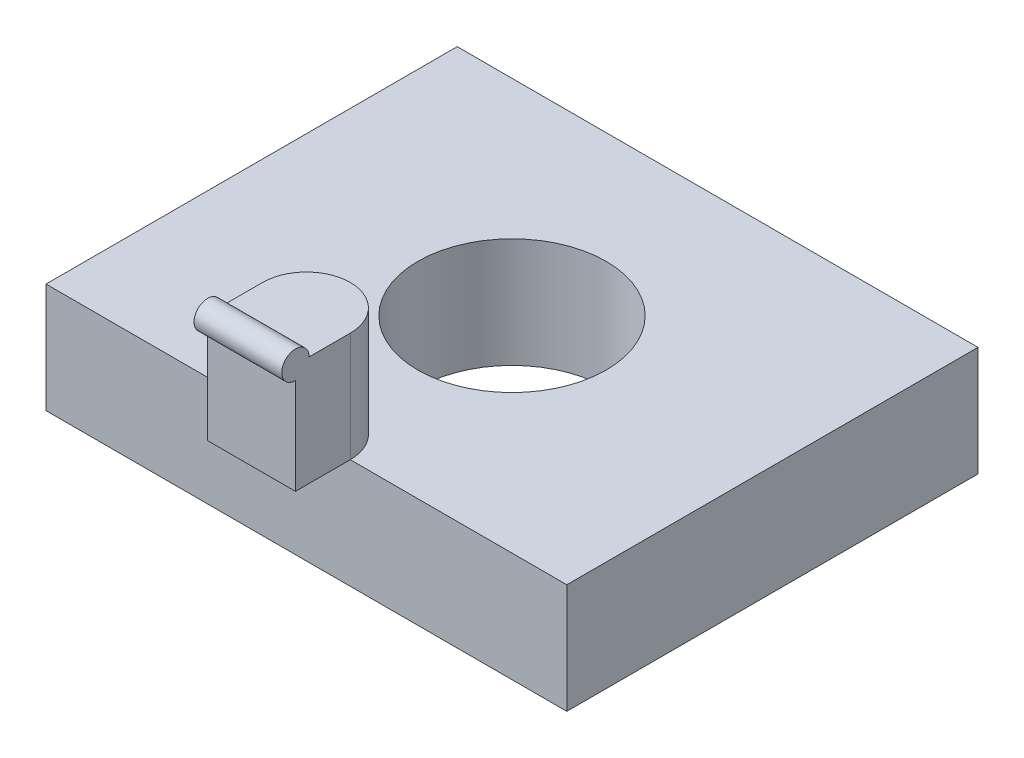
ISO-10303-21;
HEADER;
FILE_DESCRIPTION(('STEP AP214'),'2;1');
FILE_NAME('part.step','',(''),(''),'','','');
FILE_SCHEMA(('AUTOMOTIVE_DESIGN { 1 0 10303 214 1 1 1 1 }'));
ENDSEC;
DATA;
#1=APPLICATION_CONTEXT('core data for automotive mechanical design processes');
#2=APPLICATION_PROTOCOL_DEFINITION('international standard','automotive_design',2000,#1);
#3=PRODUCT_CONTEXT('',#1,'mechanical');
#4=PRODUCT('Part','Part','',(#3));
#5=PRODUCT_RELATED_PRODUCT_CATEGORY('part','',(#4));
#6=PRODUCT_DEFINITION_FORMATION('','',#4);
#7=PRODUCT_DEFINITION_CONTEXT('part definition',#1,'design');
#8=PRODUCT_DEFINITION('design','',#6,#7);
#9=PRODUCT_DEFINITION_SHAPE('','',#8);
#10=(LENGTH_UNIT() NAMED_UNIT(*) SI_UNIT(.MILLI.,.METRE.));
#11=(NAMED_UNIT(*) PLANE_ANGLE_UNIT() SI_UNIT($,.RADIAN.));
#12=(NAMED_UNIT(*) SI_UNIT($,.STERADIAN.) SOLID_ANGLE_UNIT());
#13=UNCERTAINTY_MEASURE_WITH_UNIT(LENGTH_MEASURE(1.E-05),#10,'distance_accuracy_value','');
#14=(GEOMETRIC_REPRESENTATION_CONTEXT(3) GLOBAL_UNCERTAINTY_ASSIGNED_CONTEXT((#13)) GLOBAL_UNIT_ASSIGNED_CONTEXT((#10,
#11,#12)) REPRESENTATION_CONTEXT('',''));
#15=CARTESIAN_POINT('',(0.,0.,0.));
#16=DIRECTION('',(0.,0.,1.));
#17=DIRECTION('',(1.,0.,0.));
#18=AXIS2_PLACEMENT_3D('',#15,#16,#17);
#19=CARTESIAN_POINT('',(-47.5,10.,37.5));
#20=DIRECTION('',(0.,0.,-1.));
#21=DIRECTION('',(-1.,0.,0.));
#22=AXIS2_PLACEMENT_3D('',#19,#20,#21);
#23=PLANE('',#22);
#24=DIRECTION('',(1.,0.,0.));
#25=VECTOR('',#24,1.);
#26=CARTESIAN_POINT('',(-8.,10.,37.5));
#27=LINE('',#26,#25);
#28=CARTESIAN_POINT('',(-8.,10.,37.5));
#29=VERTEX_POINT('',#28);
#30=CARTESIAN_POINT('',(8.,10.,37.5));
#31=VERTEX_POINT('',#30);
#32=EDGE_CURVE('E135',#29,#31,#27,.T.);
#33=ORIENTED_EDGE('',*,*,#32,.F.);
#34=DIRECTION('',(1.,0.,0.));
#35=VECTOR('',#34,1.);
#36=CARTESIAN_POINT('',(-47.5,10.,37.5));
#37=LINE('',#36,#35);
#38=CARTESIAN_POINT('',(-47.5,10.,37.5));
#39=VERTEX_POINT('',#38);
#40=EDGE_CURVE('E170',#39,#29,#37,.T.);
#41=ORIENTED_EDGE('',*,*,#40,.F.);
#42=DIRECTION('',(0.,-1.,0.));
#43=VECTOR('',#42,1.);
#44=CARTESIAN_POINT('',(-47.5,10.,37.5));
#45=LINE('',#44,#43);
#46=CARTESIAN_POINT('',(-47.5,-10.,37.5));
#47=VERTEX_POINT('',#46);
#48=EDGE_CURVE('E183',#39,#47,#45,.T.);
#49=ORIENTED_EDGE('',*,*,#48,.T.);
#50=DIRECTION('',(1.,0.,0.));
#51=VECTOR('',#50,1.);
#52=CARTESIAN_POINT('',(-47.5,-10.,37.5));
#53=LINE('',#52,#51);
#54=CARTESIAN_POINT('',(47.5,-10.,37.5));
#55=VERTEX_POINT('',#54);
#56=EDGE_CURVE('E165',#47,#55,#53,.T.);
#57=ORIENTED_EDGE('',*,*,#56,.T.);
#58=DIRECTION('',(0.,-1.,0.));
#59=VECTOR('',#58,1.);
#60=CARTESIAN_POINT('',(47.5,10.,37.5));
#61=LINE('',#60,#59);
#62=CARTESIAN_POINT('',(47.5,10.,37.5));
#63=VERTEX_POINT('',#62);
#64=EDGE_CURVE('E173',#63,#55,#61,.T.);
#65=ORIENTED_EDGE('',*,*,#64,.F.);
#66=EDGE_CURVE('E169',#31,#63,#37,.T.);
#67=ORIENTED_EDGE('',*,*,#66,.F.);
#68=EDGE_LOOP('',(#33,#41,#49,#57,#65,#67));
#69=FACE_BOUND('',#68,.T.);
#70=ADVANCED_FACE('F39',(#69),#23,.F.);
#71=CARTESIAN_POINT('',(47.5,10.,-37.5));
#72=DIRECTION('',(-1.,0.,0.));
#73=DIRECTION('',(0.,0.,1.));
#74=AXIS2_PLACEMENT_3D('',#71,#72,#73);
#75=PLANE('',#74);
#76=DIRECTION('',(0.,0.,-1.));
#77=VECTOR('',#76,1.);
#78=CARTESIAN_POINT('',(47.5,-10.,-37.5));
#79=LINE('',#78,#77);
#80=CARTESIAN_POINT('',(47.5,-10.,-37.5));
#81=VERTEX_POINT('',#80);
#82=EDGE_CURVE('E160',#55,#81,#79,.T.);
#83=ORIENTED_EDGE('',*,*,#82,.T.);
#84=DIRECTION('',(0.,-1.,0.));
#85=VECTOR('',#84,1.);
#86=CARTESIAN_POINT('',(47.5,10.,-37.5));
#87=LINE('',#86,#85);
#88=CARTESIAN_POINT('',(47.5,10.,-37.5));
#89=VERTEX_POINT('',#88);
#90=EDGE_CURVE('E47',#89,#81,#87,.T.);
#91=ORIENTED_EDGE('',*,*,#90,.F.);
#92=DIRECTION('',(0.,0.,-1.));
#93=VECTOR('',#92,1.);
#94=CARTESIAN_POINT('',(47.5,10.,-37.5));
#95=LINE('',#94,#93);
#96=EDGE_CURVE('E161',#63,#89,#95,.T.);
#97=ORIENTED_EDGE('',*,*,#96,.F.);
#98=ORIENTED_EDGE('',*,*,#64,.T.);
#99=EDGE_LOOP('',(#83,#91,#97,#98));
#100=FACE_BOUND('',#99,.T.);
#101=ADVANCED_FACE('F41',(#100),#75,.F.);
#102=CARTESIAN_POINT('',(-47.5,10.,-37.5));
#103=DIRECTION('',(0.,0.,1.));
#104=DIRECTION('',(1.,0.,0.));
#105=AXIS2_PLACEMENT_3D('',#102,#103,#104);
#106=PLANE('',#105);
#107=DIRECTION('',(-1.,0.,0.));
#108=VECTOR('',#107,1.);
#109=CARTESIAN_POINT('',(-47.5,-10.,-37.5));
#110=LINE('',#109,#108);
#111=CARTESIAN_POINT('',(-47.5,-10.,-37.5));
#112=VERTEX_POINT('',#111);
#113=EDGE_CURVE('E176',#81,#112,#110,.T.);
#114=ORIENTED_EDGE('',*,*,#113,.T.);
#115=DIRECTION('',(0.,-1.,0.));
#116=VECTOR('',#115,1.);
#117=CARTESIAN_POINT('',(-47.5,10.,-37.5));
#118=LINE('',#117,#116);
#119=CARTESIAN_POINT('',(-47.5,10.,-37.5));
#120=VERTEX_POINT('',#119);
#121=EDGE_CURVE('E186',#120,#112,#118,.T.);
#122=ORIENTED_EDGE('',*,*,#121,.F.);
#123=DIRECTION('',(-1.,0.,0.));
#124=VECTOR('',#123,1.);
#125=CARTESIAN_POINT('',(-47.5,10.,-37.5));
#126=LINE('',#125,#124);
#127=EDGE_CURVE('E164',#89,#120,#126,.T.);
#128=ORIENTED_EDGE('',*,*,#127,.F.);
#129=ORIENTED_EDGE('',*,*,#90,.T.);
#130=EDGE_LOOP('',(#114,#122,#128,#129));
#131=FACE_BOUND('',#130,.T.);
#132=ADVANCED_FACE('F191',(#131),#106,.F.);
#133=CARTESIAN_POINT('',(-47.5,10.,-37.5));
#134=DIRECTION('',(1.,0.,0.));
#135=DIRECTION('',(0.,0.,-1.));
#136=AXIS2_PLACEMENT_3D('',#133,#134,#135);
#137=PLANE('',#136);
#138=DIRECTION('',(0.,0.,1.));
#139=VECTOR('',#138,1.);
#140=CARTESIAN_POINT('',(-47.5,-10.,-37.5));
#141=LINE('',#140,#139);
#142=EDGE_CURVE('E178',#112,#47,#141,.T.);
#143=ORIENTED_EDGE('',*,*,#142,.T.);
#144=ORIENTED_EDGE('',*,*,#48,.F.);
#145=DIRECTION('',(0.,0.,1.));
#146=VECTOR('',#145,1.);
#147=CARTESIAN_POINT('',(-47.5,10.,-37.5));
#148=LINE('',#147,#146);
#149=EDGE_CURVE('E167',#120,#39,#148,.T.);
#150=ORIENTED_EDGE('',*,*,#149,.F.);
#151=ORIENTED_EDGE('',*,*,#121,.T.);
#152=EDGE_LOOP('',(#143,#144,#150,#151));
#153=FACE_BOUND('',#152,.T.);
#154=ADVANCED_FACE('F203',(#153),#137,.F.);
#155=CARTESIAN_POINT('',(0.,10.,0.));
#156=DIRECTION('',(0.,1.,0.));
#157=DIRECTION('',(0.,0.,1.));
#158=AXIS2_PLACEMENT_3D('',#155,#156,#157);
#159=PLANE('',#158);
#160=CARTESIAN_POINT('',(0.,10.,0.));
#161=DIRECTION('',(0.,1.,0.));
#162=DIRECTION('',(0.,0.,1.));
#163=AXIS2_PLACEMENT_3D('',#160,#161,#162);
#164=CIRCLE('',#163,17.1788823120691);
#165=CARTESIAN_POINT('',(0.,10.,17.1788823120691));
#166=VERTEX_POINT('',#165);
#167=EDGE_CURVE('E131',#166,#166,#164,.T.);
#168=ORIENTED_EDGE('',*,*,#167,.F.);
#169=EDGE_LOOP('',(#168));
#170=FACE_BOUND('',#169,.T.);
#171=CARTESIAN_POINT('',(0.,10.,37.5));
#172=DIRECTION('',(0.,1.,0.));
#173=DIRECTION('',(0.,0.,1.));
#174=AXIS2_PLACEMENT_3D('',#171,#172,#173);
#175=CIRCLE('',#174,8.);
#176=EDGE_CURVE('E156',#31,#29,#175,.T.);
#177=ORIENTED_EDGE('',*,*,#176,.F.);
#178=ORIENTED_EDGE('',*,*,#66,.T.);
#179=ORIENTED_EDGE('',*,*,#96,.T.);
#180=ORIENTED_EDGE('',*,*,#127,.T.);
#181=ORIENTED_EDGE('',*,*,#149,.T.);
#182=ORIENTED_EDGE('',*,*,#40,.T.);
#183=EDGE_LOOP('',(#177,#178,#179,#180,#181,#182));
#184=FACE_BOUND('',#183,.T.);
#185=ADVANCED_FACE('F210',(#170,#184),#159,.T.);
#186=CARTESIAN_POINT('',(0.,-10.,0.));
#187=DIRECTION('',(0.,1.,0.));
#188=DIRECTION('',(0.,0.,1.));
#189=AXIS2_PLACEMENT_3D('',#186,#187,#188);
#190=PLANE('',#189);
#191=CARTESIAN_POINT('',(0.,-10.,0.));
#192=DIRECTION('',(0.,1.,0.));
#193=DIRECTION('',(0.,0.,1.));
#194=AXIS2_PLACEMENT_3D('',#191,#192,#193);
#195=CIRCLE('',#194,17.1788823120691);
#196=CARTESIAN_POINT('',(0.,-10.,17.1788823120691));
#197=VERTEX_POINT('',#196);
#198=EDGE_CURVE('E132',#197,#197,#195,.T.);
#199=ORIENTED_EDGE('',*,*,#198,.T.);
#200=EDGE_LOOP('',(#199));
#201=FACE_BOUND('',#200,.T.);
#202=ORIENTED_EDGE('',*,*,#82,.F.);
#203=ORIENTED_EDGE('',*,*,#56,.F.);
#204=ORIENTED_EDGE('',*,*,#142,.F.);
#205=ORIENTED_EDGE('',*,*,#113,.F.);
#206=EDGE_LOOP('',(#202,#203,#204,#205));
#207=FACE_BOUND('',#206,.T.);
#208=ADVANCED_FACE('F199',(#201,#207),#190,.F.);
#209=CARTESIAN_POINT('',(0.,30.,37.5));
#210=DIRECTION('',(0.,1.,0.));
#211=DIRECTION('',(0.,0.,1.));
#212=AXIS2_PLACEMENT_3D('',#209,#210,#211);
#213=PLANE('',#212);
#214=DIRECTION('',(-1.,0.,0.));
#215=VECTOR('',#214,1.);
#216=CARTESIAN_POINT('',(8.,30.,45.));
#217=LINE('',#216,#215);
#218=CARTESIAN_POINT('',(8.,30.,45.));
#219=VERTEX_POINT('',#218);
#220=CARTESIAN_POINT('',(-8.,30.,45.));
#221=VERTEX_POINT('',#220);
#222=EDGE_CURVE('E58',#219,#221,#217,.T.);
#223=ORIENTED_EDGE('',*,*,#222,.F.);
#224=DIRECTION('',(0.,0.,-1.));
#225=VECTOR('',#224,1.);
#226=CARTESIAN_POINT('',(8.,30.,47.5));
#227=LINE('',#226,#225);
#228=CARTESIAN_POINT('',(8.,30.,37.5000000000001));
#229=VERTEX_POINT('',#228);
#230=EDGE_CURVE('E126',#219,#229,#227,.T.);
#231=ORIENTED_EDGE('',*,*,#230,.T.);
#232=CARTESIAN_POINT('',(0.,30.,37.5));
#233=DIRECTION('',(0.,1.,0.));
#234=DIRECTION('',(0.,0.,1.));
#235=AXIS2_PLACEMENT_3D('',#232,#233,#234);
#236=CIRCLE('',#235,8.);
#237=CARTESIAN_POINT('',(-8.,30.,37.5));
#238=VERTEX_POINT('',#237);
#239=EDGE_CURVE('E158',#229,#238,#236,.T.);
#240=ORIENTED_EDGE('',*,*,#239,.T.);
#241=DIRECTION('',(0.,0.,-1.));
#242=VECTOR('',#241,1.);
#243=CARTESIAN_POINT('',(-8.,30.,47.5));
#244=LINE('',#243,#242);
#245=EDGE_CURVE('E54',#221,#238,#244,.T.);
#246=ORIENTED_EDGE('',*,*,#245,.F.);
#247=EDGE_LOOP('',(#223,#231,#240,#246));
#248=FACE_BOUND('',#247,.T.);
#249=ADVANCED_FACE('F220',(#248),#213,.T.);
#250=CARTESIAN_POINT('',(0.,10.,37.5));
#251=DIRECTION('',(0.,1.,0.));
#252=DIRECTION('',(0.,0.,1.));
#253=AXIS2_PLACEMENT_3D('',#250,#251,#252);
#254=CYLINDRICAL_SURFACE('',#253,8.);
#255=DIRECTION('',(0.,-1.,0.));
#256=VECTOR('',#255,1.);
#257=CARTESIAN_POINT('',(8.,30.,37.5000000000001));
#258=LINE('',#257,#256);
#259=EDGE_CURVE('E153',#229,#31,#258,.T.);
#260=ORIENTED_EDGE('',*,*,#259,.T.);
#261=ORIENTED_EDGE('',*,*,#176,.T.);
#262=DIRECTION('',(0.,-1.,0.));
#263=VECTOR('',#262,1.);
#264=CARTESIAN_POINT('',(-8.,30.,37.5));
#265=LINE('',#264,#263);
#266=EDGE_CURVE('E150',#238,#29,#265,.T.);
#267=ORIENTED_EDGE('',*,*,#266,.F.);
#268=ORIENTED_EDGE('',*,*,#239,.F.);
#269=EDGE_LOOP('',(#260,#261,#267,#268));
#270=FACE_BOUND('',#269,.T.);
#271=ADVANCED_FACE('F213',(#270),#254,.T.);
#272=CARTESIAN_POINT('',(-8.,30.,47.5));
#273=DIRECTION('',(1.,0.,0.));
#274=DIRECTION('',(0.,0.,-1.));
#275=AXIS2_PLACEMENT_3D('',#272,#273,#274);
#276=PLANE('',#275);
#277=DIRECTION('',(0.,-1.,0.));
#278=VECTOR('',#277,1.);
#279=CARTESIAN_POINT('',(-8.,30.,47.5));
#280=LINE('',#279,#278);
#281=CARTESIAN_POINT('',(-8.,27.5,47.5));
#282=VERTEX_POINT('',#281);
#283=CARTESIAN_POINT('',(-8.,10.,47.5));
#284=VERTEX_POINT('',#283);
#285=EDGE_CURVE('E138',#282,#284,#280,.T.);
#286=ORIENTED_EDGE('',*,*,#285,.F.);
#287=CARTESIAN_POINT('',(-8.,30.,47.5));
#288=DIRECTION('',(-1.,0.,0.));
#289=DIRECTION('',(0.,0.,1.));
#290=AXIS2_PLACEMENT_3D('',#287,#288,#289);
#291=CIRCLE('',#290,2.5);
#292=EDGE_CURVE('E123',#282,#221,#291,.T.);
#293=ORIENTED_EDGE('',*,*,#292,.T.);
#294=ORIENTED_EDGE('',*,*,#245,.T.);
#295=ORIENTED_EDGE('',*,*,#266,.T.);
#296=DIRECTION('',(0.,0.,-1.));
#297=VECTOR('',#296,1.);
#298=CARTESIAN_POINT('',(-8.,10.,47.5));
#299=LINE('',#298,#297);
#300=EDGE_CURVE('E147',#284,#29,#299,.T.);
#301=ORIENTED_EDGE('',*,*,#300,.F.);
#302=EDGE_LOOP('',(#286,#293,#294,#295,#301));
#303=FACE_BOUND('',#302,.T.);
#304=ADVANCED_FACE('F219',(#303),#276,.F.);
#305=CARTESIAN_POINT('',(-8.,10.,47.5));
#306=DIRECTION('',(0.,1.,0.));
#307=DIRECTION('',(0.,0.,1.));
#308=AXIS2_PLACEMENT_3D('',#305,#306,#307);
#309=PLANE('',#308);
#310=ORIENTED_EDGE('',*,*,#32,.T.);
#311=DIRECTION('',(0.,0.,-1.));
#312=VECTOR('',#311,1.);
#313=CARTESIAN_POINT('',(8.,10.,47.5));
#314=LINE('',#313,#312);
#315=CARTESIAN_POINT('',(8.,10.,47.5));
#316=VERTEX_POINT('',#315);
#317=EDGE_CURVE('E145',#316,#31,#314,.T.);
#318=ORIENTED_EDGE('',*,*,#317,.F.);
#319=DIRECTION('',(1.,0.,0.));
#320=VECTOR('',#319,1.);
#321=CARTESIAN_POINT('',(-8.,10.,47.5));
#322=LINE('',#321,#320);
#323=EDGE_CURVE('E111',#284,#316,#322,.T.);
#324=ORIENTED_EDGE('',*,*,#323,.F.);
#325=ORIENTED_EDGE('',*,*,#300,.T.);
#326=EDGE_LOOP('',(#310,#318,#324,#325));
#327=FACE_BOUND('',#326,.T.);
#328=ADVANCED_FACE('F216',(#327),#309,.F.);
#329=CARTESIAN_POINT('',(8.,30.,47.5));
#330=DIRECTION('',(-1.,0.,0.));
#331=DIRECTION('',(0.,0.,1.));
#332=AXIS2_PLACEMENT_3D('',#329,#330,#331);
#333=PLANE('',#332);
#334=ORIENTED_EDGE('',*,*,#230,.F.);
#335=CARTESIAN_POINT('',(8.,30.,47.5));
#336=DIRECTION('',(-1.,0.,0.));
#337=DIRECTION('',(0.,0.,1.));
#338=AXIS2_PLACEMENT_3D('',#335,#336,#337);
#339=CIRCLE('',#338,2.5);
#340=CARTESIAN_POINT('',(8.,27.5,47.5));
#341=VERTEX_POINT('',#340);
#342=EDGE_CURVE('E121',#341,#219,#339,.T.);
#343=ORIENTED_EDGE('',*,*,#342,.F.);
#344=DIRECTION('',(0.,1.,0.));
#345=VECTOR('',#344,1.);
#346=CARTESIAN_POINT('',(8.,30.,47.5));
#347=LINE('',#346,#345);
#348=EDGE_CURVE('E107',#316,#341,#347,.T.);
#349=ORIENTED_EDGE('',*,*,#348,.F.);
#350=ORIENTED_EDGE('',*,*,#317,.T.);
#351=ORIENTED_EDGE('',*,*,#259,.F.);
#352=EDGE_LOOP('',(#334,#343,#349,#350,#351));
#353=FACE_BOUND('',#352,.T.);
#354=ADVANCED_FACE('F124',(#353),#333,.F.);
#355=CARTESIAN_POINT('',(0.,0.,47.5));
#356=DIRECTION('',(0.,0.,1.));
#357=DIRECTION('',(1.,0.,0.));
#358=AXIS2_PLACEMENT_3D('',#355,#356,#357);
#359=PLANE('',#358);
#360=DIRECTION('',(-1.,0.,0.));
#361=VECTOR('',#360,1.);
#362=CARTESIAN_POINT('',(8.,27.5,47.5));
#363=LINE('',#362,#361);
#364=EDGE_CURVE('E11',#282,#341,#363,.F.);
#365=ORIENTED_EDGE('',*,*,#364,.F.);
#366=ORIENTED_EDGE('',*,*,#285,.T.);
#367=ORIENTED_EDGE('',*,*,#323,.T.);
#368=ORIENTED_EDGE('',*,*,#348,.T.);
#369=EDGE_LOOP('',(#365,#366,#367,#368));
#370=FACE_BOUND('',#369,.T.);
#371=ADVANCED_FACE('F108',(#370),#359,.T.);
#372=CARTESIAN_POINT('',(0.,-10.,0.));
#373=DIRECTION('',(0.,1.,0.));
#374=DIRECTION('',(0.,0.,1.));
#375=AXIS2_PLACEMENT_3D('',#372,#373,#374);
#376=CYLINDRICAL_SURFACE('',#375,17.1788823120691);
#377=ORIENTED_EDGE('',*,*,#198,.F.);
#378=EDGE_LOOP('',(#377));
#379=FACE_BOUND('',#378,.T.);
#380=ORIENTED_EDGE('',*,*,#167,.T.);
#381=EDGE_LOOP('',(#380));
#382=FACE_BOUND('',#381,.T.);
#383=ADVANCED_FACE('F287',(#379,#382),#376,.F.);
#384=CARTESIAN_POINT('',(8.,30.,47.5));
#385=DIRECTION('',(-1.,0.,0.));
#386=DIRECTION('',(0.,0.,1.));
#387=AXIS2_PLACEMENT_3D('',#384,#385,#386);
#388=CYLINDRICAL_SURFACE('',#387,2.5);
#389=ORIENTED_EDGE('',*,*,#342,.T.);
#390=ORIENTED_EDGE('',*,*,#222,.T.);
#391=ORIENTED_EDGE('',*,*,#292,.F.);
#392=ORIENTED_EDGE('',*,*,#364,.T.);
#393=EDGE_LOOP('',(#389,#390,#391,#392));
#394=FACE_BOUND('',#393,.T.);
#395=ADVANCED_FACE('F120',(#394),#388,.T.);
#396=CLOSED_SHELL('',(#70,#101,#132,#154,#185,#208,#249,#271,#304,#328,#354,#371,#383,#395));
#397=MANIFOLD_SOLID_BREP('B2',#396);
#398=ADVANCED_BREP_SHAPE_REPRESENTATION('',(#18,#397),#14);
#399=SHAPE_DEFINITION_REPRESENTATION(#9,#398);
ENDSEC;
END-ISO-10303-21;
